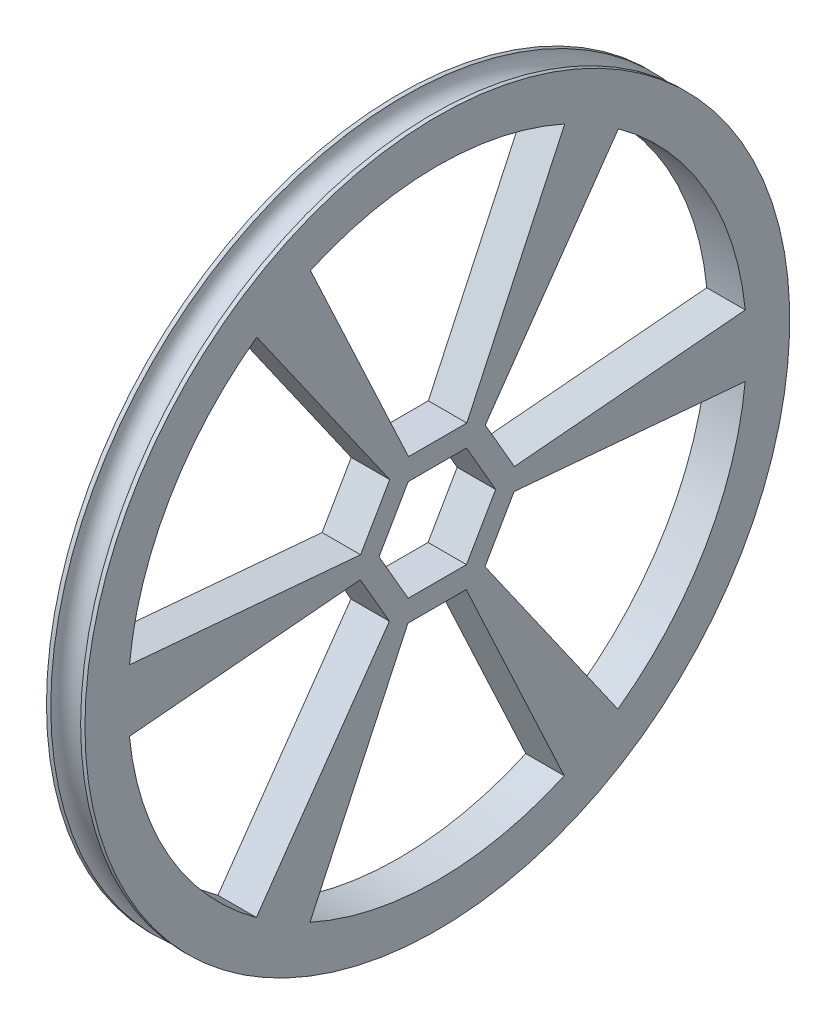
ISO-10303-21;
HEADER;
FILE_DESCRIPTION(('STEP AP214'),'2;1');
FILE_NAME('part.step','',(''),(''),'','','');
FILE_SCHEMA(('AUTOMOTIVE_DESIGN { 1 0 10303 214 1 1 1 1 }'));
ENDSEC;
DATA;
#1=APPLICATION_CONTEXT('core data for automotive mechanical design processes');
#2=APPLICATION_PROTOCOL_DEFINITION('international standard','automotive_design',2000,#1);
#3=PRODUCT_CONTEXT('',#1,'mechanical');
#4=PRODUCT('Part','Part','',(#3));
#5=PRODUCT_RELATED_PRODUCT_CATEGORY('part','',(#4));
#6=PRODUCT_DEFINITION_FORMATION('','',#4);
#7=PRODUCT_DEFINITION_CONTEXT('part definition',#1,'design');
#8=PRODUCT_DEFINITION('design','',#6,#7);
#9=PRODUCT_DEFINITION_SHAPE('','',#8);
#10=(LENGTH_UNIT() NAMED_UNIT(*) SI_UNIT(.MILLI.,.METRE.));
#11=(NAMED_UNIT(*) PLANE_ANGLE_UNIT() SI_UNIT($,.RADIAN.));
#12=(NAMED_UNIT(*) SI_UNIT($,.STERADIAN.) SOLID_ANGLE_UNIT());
#13=UNCERTAINTY_MEASURE_WITH_UNIT(LENGTH_MEASURE(1.E-05),#10,'distance_accuracy_value','');
#14=(GEOMETRIC_REPRESENTATION_CONTEXT(3) GLOBAL_UNCERTAINTY_ASSIGNED_CONTEXT((#13)) GLOBAL_UNIT_ASSIGNED_CONTEXT((#10,
#11,#12)) REPRESENTATION_CONTEXT('',''));
#15=CARTESIAN_POINT('',(0.,0.,0.));
#16=DIRECTION('',(0.,0.,1.));
#17=DIRECTION('',(1.,0.,0.));
#18=AXIS2_PLACEMENT_3D('',#15,#16,#17);
#19=CARTESIAN_POINT('',(4.0396,0.438161309822831,0.038334147405172));
#20=DIRECTION('',(0.,0.996194698091745,0.0871557427476677));
#21=DIRECTION('',(0.,-0.0871557427476677,0.996194698091745));
#22=AXIS2_PLACEMENT_3D('',#19,#20,#21);
#23=PLANE('',#22);
#24=DIRECTION('',(0.,0.0871557427476677,-0.996194698091745));
#25=VECTOR('',#24,1.);
#26=CARTESIAN_POINT('',(4.0386,0.438161309822831,0.038334147405172));
#27=LINE('',#26,#25);
#28=CARTESIAN_POINT('',(4.0386,1.23855993231517,-9.11026397073945));
#29=VERTEX_POINT('',#28);
#30=CARTESIAN_POINT('',(4.0386,3.62573925965265,-36.3958485382744));
#31=VERTEX_POINT('',#30);
#32=EDGE_CURVE('E42',#29,#31,#27,.T.);
#33=ORIENTED_EDGE('',*,*,#32,.T.);
#34=DIRECTION('',(-1.,0.,0.));
#35=VECTOR('',#34,1.);
#36=CARTESIAN_POINT('',(4.0396,3.62573925965265,-36.3958485382744));
#37=LINE('',#36,#35);
#38=CARTESIAN_POINT('',(-0.507999999999998,3.62573925965265,-36.3958485382744));
#39=VERTEX_POINT('',#38);
#40=EDGE_CURVE('E480',#31,#39,#37,.T.);
#41=ORIENTED_EDGE('',*,*,#40,.T.);
#42=DIRECTION('',(0.,0.0871557427476676,-0.996194698091745));
#43=VECTOR('',#42,1.);
#44=CARTESIAN_POINT('',(-0.507999999999998,0.438161309822831,0.038334147405172));
#45=LINE('',#44,#43);
#46=CARTESIAN_POINT('',(-0.507999999999998,1.23855993231517,-9.11026397073945));
#47=VERTEX_POINT('',#46);
#48=EDGE_CURVE('E11',#47,#39,#45,.T.);
#49=ORIENTED_EDGE('',*,*,#48,.F.);
#50=DIRECTION('',(-1.,0.,0.));
#51=VECTOR('',#50,1.);
#52=CARTESIAN_POINT('',(4.0396,1.23855993231518,-9.11026397073945));
#53=LINE('',#52,#51);
#54=EDGE_CURVE('E462',#29,#47,#53,.T.);
#55=ORIENTED_EDGE('',*,*,#54,.F.);
#56=EDGE_LOOP('',(#33,#41,#49,#55));
#57=FACE_BOUND('',#56,.T.);
#58=ADVANCED_FACE('F35',(#57),#23,.T.);
#59=CARTESIAN_POINT('',(4.0396,0.,0.));
#60=DIRECTION('',(-1.,0.,0.));
#61=DIRECTION('',(0.,0.866025403784433,0.50000000000001));
#62=AXIS2_PLACEMENT_3D('',#59,#60,#61);
#63=CYLINDRICAL_SURFACE('',#62,36.576);
#64=CARTESIAN_POINT('',(4.0386,0.,0.));
#65=DIRECTION('',(1.,0.,0.));
#66=DIRECTION('',(0.,-0.866025403784433,-0.50000000000001));
#67=AXIS2_PLACEMENT_3D('',#64,#65,#66);
#68=CIRCLE('',#67,36.576);
#69=CARTESIAN_POINT('',(4.0386,29.6680661941148,-21.3918120855065));
#70=VERTEX_POINT('',#69);
#71=EDGE_CURVE('E49',#31,#70,#68,.T.);
#72=ORIENTED_EDGE('',*,*,#71,.T.);
#73=DIRECTION('',(-1.,0.,0.));
#74=VECTOR('',#73,1.);
#75=CARTESIAN_POINT('',(4.0396,29.6680661941148,-21.3918120855065));
#76=LINE('',#75,#74);
#77=CARTESIAN_POINT('',(-0.507999999999998,29.6680661941148,-21.3918120855065));
#78=VERTEX_POINT('',#77);
#79=EDGE_CURVE('E474',#70,#78,#76,.T.);
#80=ORIENTED_EDGE('',*,*,#79,.T.);
#81=CARTESIAN_POINT('',(-0.507999999999998,0.,0.));
#82=DIRECTION('',(-1.,0.,0.));
#83=DIRECTION('',(0.,0.866025403784433,0.50000000000001));
#84=AXIS2_PLACEMENT_3D('',#81,#82,#83);
#85=CIRCLE('',#84,36.576);
#86=EDGE_CURVE('E56',#39,#78,#85,.F.);
#87=ORIENTED_EDGE('',*,*,#86,.F.);
#88=ORIENTED_EDGE('',*,*,#40,.F.);
#89=EDGE_LOOP('',(#72,#80,#87,#88));
#90=FACE_BOUND('',#89,.T.);
#91=ADVANCED_FACE('F491',(#90),#63,.F.);
#92=CARTESIAN_POINT('',(4.0396,-0.290369009890764,-0.414689922695186));
#93=DIRECTION('',(0.,0.573576436351037,0.819152044288998));
#94=DIRECTION('',(0.,-0.819152044288998,0.573576436351037));
#95=AXIS2_PLACEMENT_3D('',#92,#93,#94);
#96=PLANE('',#95);
#97=DIRECTION('',(-1.,0.,0.));
#98=VECTOR('',#97,1.);
#99=CARTESIAN_POINT('',(4.0396,7.2069837744007,-5.6643928588735));
#100=LINE('',#99,#98);
#101=CARTESIAN_POINT('',(4.0386,7.2069837744007,-5.6643928588735));
#102=VERTEX_POINT('',#101);
#103=CARTESIAN_POINT('',(-0.507999999999998,7.2069837744007,-5.6643928588735));
#104=VERTEX_POINT('',#103);
#105=EDGE_CURVE('E466',#102,#104,#100,.T.);
#106=ORIENTED_EDGE('',*,*,#105,.T.);
#107=DIRECTION('',(0.,0.819152044288998,-0.573576436351037));
#108=VECTOR('',#107,1.);
#109=CARTESIAN_POINT('',(-0.507999999999998,-0.290369009890764,-0.414689922695186));
#110=LINE('',#109,#108);
#111=EDGE_CURVE('E472',#104,#78,#110,.T.);
#112=ORIENTED_EDGE('',*,*,#111,.T.);
#113=ORIENTED_EDGE('',*,*,#79,.F.);
#114=DIRECTION('',(0.,0.819152044288998,-0.573576436351037));
#115=VECTOR('',#114,1.);
#116=CARTESIAN_POINT('',(4.0386,-0.290369009890764,-0.414689922695186));
#117=LINE('',#116,#115);
#118=EDGE_CURVE('E476',#102,#70,#117,.T.);
#119=ORIENTED_EDGE('',*,*,#118,.F.);
#120=EDGE_LOOP('',(#106,#112,#113,#119));
#121=FACE_BOUND('',#120,.T.);
#122=ADVANCED_FACE('F489',(#121),#96,.F.);
#123=CARTESIAN_POINT('',(4.0396,4.25450000000008,-7.36901016080174));
#124=DIRECTION('',(0.,-0.50000000000001,0.866025403784433));
#125=DIRECTION('',(0.,-0.866025403784433,-0.50000000000001));
#126=AXIS2_PLACEMENT_3D('',#123,#124,#125);
#127=PLANE('',#126);
#128=ORIENTED_EDGE('',*,*,#54,.T.);
#129=DIRECTION('',(0.,0.866025403784433,0.50000000000001));
#130=VECTOR('',#129,1.);
#131=CARTESIAN_POINT('',(-0.507999999999998,4.25450000000008,-7.36901016080174));
#132=LINE('',#131,#130);
#133=EDGE_CURVE('E464',#47,#104,#132,.T.);
#134=ORIENTED_EDGE('',*,*,#133,.T.);
#135=ORIENTED_EDGE('',*,*,#105,.F.);
#136=DIRECTION('',(0.,0.866025403784433,0.50000000000001));
#137=VECTOR('',#136,1.);
#138=CARTESIAN_POINT('',(4.0386,4.25450000000008,-7.36901016080174));
#139=LINE('',#138,#137);
#140=EDGE_CURVE('E469',#29,#102,#139,.T.);
#141=ORIENTED_EDGE('',*,*,#140,.F.);
#142=EDGE_LOOP('',(#128,#134,#135,#141));
#143=FACE_BOUND('',#142,.T.);
#144=ADVANCED_FACE('F496',(#143),#127,.F.);
#145=CARTESIAN_POINT('',(4.0396,0.252279000396711,-0.36029175155945));
#146=DIRECTION('',(0.,0.573576436351052,-0.819152044288988));
#147=DIRECTION('',(0.,0.819152044288988,0.573576436351052));
#148=AXIS2_PLACEMENT_3D('',#145,#146,#147);
#149=PLANE('',#148);
#150=DIRECTION('',(0.,-0.819152044288988,-0.573576436351052));
#151=VECTOR('',#150,1.);
#152=CARTESIAN_POINT('',(4.0386,0.252279000396711,-0.36029175155945));
#153=LINE('',#152,#151);
#154=CARTESIAN_POINT('',(4.0386,-7.27044006768488,-5.62775635086418));
#155=VERTEX_POINT('',#154);
#156=CARTESIAN_POINT('',(4.0386,-29.7068597966101,-21.3379065754949));
#157=VERTEX_POINT('',#156);
#158=EDGE_CURVE('E456',#155,#157,#153,.T.);
#159=ORIENTED_EDGE('',*,*,#158,.T.);
#160=DIRECTION('',(-1.,0.,0.));
#161=VECTOR('',#160,1.);
#162=CARTESIAN_POINT('',(4.0396,-29.7068597966101,-21.3379065754949));
#163=LINE('',#162,#161);
#164=CARTESIAN_POINT('',(-0.507999999999998,-29.7068597966101,-21.3379065754949));
#165=VERTEX_POINT('',#164);
#166=EDGE_CURVE('E453',#157,#165,#163,.T.);
#167=ORIENTED_EDGE('',*,*,#166,.T.);
#168=DIRECTION('',(0.,-0.819152044288988,-0.573576436351052));
#169=VECTOR('',#168,1.);
#170=CARTESIAN_POINT('',(-0.507999999999998,0.252279000396711,-0.36029175155945));
#171=LINE('',#170,#169);
#172=CARTESIAN_POINT('',(-0.507999999999998,-7.27044006768488,-5.62775635086418));
#173=VERTEX_POINT('',#172);
#174=EDGE_CURVE('E459',#173,#165,#171,.T.);
#175=ORIENTED_EDGE('',*,*,#174,.F.);
#176=DIRECTION('',(-1.,0.,0.));
#177=VECTOR('',#176,1.);
#178=CARTESIAN_POINT('',(4.0396,-7.27044006768488,-5.62775635086418));
#179=LINE('',#178,#177);
#180=EDGE_CURVE('E429',#155,#173,#179,.T.);
#181=ORIENTED_EDGE('',*,*,#180,.F.);
#182=EDGE_LOOP('',(#159,#167,#175,#181));
#183=FACE_BOUND('',#182,.T.);
#184=ADVANCED_FACE('F498',(#183),#149,.T.);
#185=CARTESIAN_POINT('',(4.0396,0.,0.));
#186=DIRECTION('',(-1.,0.,0.));
#187=DIRECTION('',(0.,0.866025403784443,-0.499999999999992));
#188=AXIS2_PLACEMENT_3D('',#185,#186,#187);
#189=CYLINDRICAL_SURFACE('',#188,36.576);
#190=CARTESIAN_POINT('',(4.0386,0.,0.));
#191=DIRECTION('',(1.,0.,0.));
#192=DIRECTION('',(0.,-0.866025403784443,0.499999999999992));
#193=AXIS2_PLACEMENT_3D('',#190,#191,#192);
#194=CIRCLE('',#193,36.576);
#195=CARTESIAN_POINT('',(4.0386,-3.6918196019743,-36.389205048015));
#196=VERTEX_POINT('',#195);
#197=EDGE_CURVE('E447',#157,#196,#194,.T.);
#198=ORIENTED_EDGE('',*,*,#197,.T.);
#199=DIRECTION('',(-1.,0.,0.));
#200=VECTOR('',#199,1.);
#201=CARTESIAN_POINT('',(4.0396,-3.6918196019743,-36.389205048015));
#202=LINE('',#201,#200);
#203=CARTESIAN_POINT('',(-0.507999999999998,-3.6918196019743,-36.389205048015));
#204=VERTEX_POINT('',#203);
#205=EDGE_CURVE('E441',#196,#204,#202,.T.);
#206=ORIENTED_EDGE('',*,*,#205,.T.);
#207=CARTESIAN_POINT('',(-0.507999999999998,0.,0.));
#208=DIRECTION('',(-1.,0.,0.));
#209=DIRECTION('',(0.,0.866025403784443,-0.499999999999992));
#210=AXIS2_PLACEMENT_3D('',#207,#208,#209);
#211=CIRCLE('',#210,36.576);
#212=EDGE_CURVE('E450',#165,#204,#211,.F.);
#213=ORIENTED_EDGE('',*,*,#212,.F.);
#214=ORIENTED_EDGE('',*,*,#166,.F.);
#215=EDGE_LOOP('',(#198,#206,#213,#214));
#216=FACE_BOUND('',#215,.T.);
#217=ADVANCED_FACE('F504',(#216),#189,.F.);
#218=CARTESIAN_POINT('',(4.0396,-0.504316512692818,0.0441219776895447));
#219=DIRECTION('',(0.,0.996194698091746,-0.0871557427476491));
#220=DIRECTION('',(0.,0.0871557427476491,0.996194698091746));
#221=AXIS2_PLACEMENT_3D('',#218,#219,#220);
#222=PLANE('',#221);
#223=DIRECTION('',(-1.,0.,0.));
#224=VECTOR('',#223,1.);
#225=CARTESIAN_POINT('',(4.0396,-1.30201622559928,-9.07362746273001));
#226=LINE('',#225,#224);
#227=CARTESIAN_POINT('',(4.0386,-1.30201622559928,-9.07362746273001));
#228=VERTEX_POINT('',#227);
#229=CARTESIAN_POINT('',(-0.507999999999998,-1.30201622559928,-9.07362746273001));
#230=VERTEX_POINT('',#229);
#231=EDGE_CURVE('E433',#228,#230,#226,.T.);
#232=ORIENTED_EDGE('',*,*,#231,.T.);
#233=DIRECTION('',(0.,-0.0871557427476492,-0.996194698091746));
#234=VECTOR('',#233,1.);
#235=CARTESIAN_POINT('',(-0.507999999999998,-0.504316512692818,0.0441219776895447));
#236=LINE('',#235,#234);
#237=EDGE_CURVE('E439',#230,#204,#236,.T.);
#238=ORIENTED_EDGE('',*,*,#237,.T.);
#239=ORIENTED_EDGE('',*,*,#205,.F.);
#240=DIRECTION('',(0.,-0.0871557427476491,-0.996194698091746));
#241=VECTOR('',#240,1.);
#242=CARTESIAN_POINT('',(4.0386,-0.504316512692818,0.0441219776895447));
#243=LINE('',#242,#241);
#244=EDGE_CURVE('E444',#228,#196,#243,.T.);
#245=ORIENTED_EDGE('',*,*,#244,.F.);
#246=EDGE_LOOP('',(#232,#238,#239,#245));
#247=FACE_BOUND('',#246,.T.);
#248=ADVANCED_FACE('F537',(#247),#222,.F.);
#249=CARTESIAN_POINT('',(4.0396,-4.25449999999994,-7.36901016080183));
#250=DIRECTION('',(0.,0.499999999999992,0.866025403784443));
#251=DIRECTION('',(0.,-0.866025403784443,0.499999999999992));
#252=AXIS2_PLACEMENT_3D('',#249,#250,#251);
#253=PLANE('',#252);
#254=ORIENTED_EDGE('',*,*,#180,.T.);
#255=DIRECTION('',(0.,0.866025403784443,-0.499999999999992));
#256=VECTOR('',#255,1.);
#257=CARTESIAN_POINT('',(-0.507999999999998,-4.25449999999994,-7.36901016080183));
#258=LINE('',#257,#256);
#259=EDGE_CURVE('E431',#173,#230,#258,.T.);
#260=ORIENTED_EDGE('',*,*,#259,.T.);
#261=ORIENTED_EDGE('',*,*,#231,.F.);
#262=DIRECTION('',(0.,0.866025403784443,-0.499999999999992));
#263=VECTOR('',#262,1.);
#264=CARTESIAN_POINT('',(4.0386,-4.25449999999994,-7.36901016080183));
#265=LINE('',#264,#263);
#266=EDGE_CURVE('E436',#155,#228,#265,.T.);
#267=ORIENTED_EDGE('',*,*,#266,.F.);
#268=EDGE_LOOP('',(#254,#260,#261,#267));
#269=FACE_BOUND('',#268,.T.);
#270=ADVANCED_FACE('F547',(#269),#253,.F.);
#271=CARTESIAN_POINT('',(4.0396,-0.185882309426124,-0.398625898964619));
#272=DIRECTION('',(0.,-0.422618261740701,-0.906307787036649));
#273=DIRECTION('',(0.,0.906307787036649,-0.422618261740701));
#274=AXIS2_PLACEMENT_3D('',#271,#272,#273);
#275=PLANE('',#274);
#276=DIRECTION('',(0.,-0.906307787036649,0.422618261740701));
#277=VECTOR('',#276,1.);
#278=CARTESIAN_POINT('',(4.0386,-0.185882309426124,-0.398625898964619));
#279=LINE('',#278,#277);
#280=CARTESIAN_POINT('',(4.0386,-8.509,3.48250761987535));
#281=VERTEX_POINT('',#280);
#282=CARTESIAN_POINT('',(4.0386,-33.3325990562625,15.0579419627798));
#283=VERTEX_POINT('',#282);
#284=EDGE_CURVE('E423',#281,#283,#279,.T.);
#285=ORIENTED_EDGE('',*,*,#284,.T.);
#286=DIRECTION('',(-1.,0.,0.));
#287=VECTOR('',#286,1.);
#288=CARTESIAN_POINT('',(4.0396,-33.3325990562625,15.0579419627798));
#289=LINE('',#288,#287);
#290=CARTESIAN_POINT('',(-0.507999999999998,-33.3325990562625,15.0579419627798));
#291=VERTEX_POINT('',#290);
#292=EDGE_CURVE('E420',#283,#291,#289,.T.);
#293=ORIENTED_EDGE('',*,*,#292,.T.);
#294=DIRECTION('',(0.,-0.906307787036649,0.422618261740701));
#295=VECTOR('',#294,1.);
#296=CARTESIAN_POINT('',(-0.507999999999998,-0.185882309426124,-0.398625898964619));
#297=LINE('',#296,#295);
#298=CARTESIAN_POINT('',(-0.507999999999998,-8.509,3.48250761987535));
#299=VERTEX_POINT('',#298);
#300=EDGE_CURVE('E426',#299,#291,#297,.T.);
#301=ORIENTED_EDGE('',*,*,#300,.F.);
#302=DIRECTION('',(-1.,0.,0.));
#303=VECTOR('',#302,1.);
#304=CARTESIAN_POINT('',(4.0396,-8.509,3.48250761987535));
#305=LINE('',#304,#303);
#306=EDGE_CURVE('E396',#281,#299,#305,.T.);
#307=ORIENTED_EDGE('',*,*,#306,.F.);
#308=EDGE_LOOP('',(#285,#293,#301,#307));
#309=FACE_BOUND('',#308,.T.);
#310=ADVANCED_FACE('F557',(#309),#275,.T.);
#311=CARTESIAN_POINT('',(4.0396,0.,0.));
#312=DIRECTION('',(-1.,0.,0.));
#313=DIRECTION('',(0.,0.,-1.));
#314=AXIS2_PLACEMENT_3D('',#311,#312,#313);
#315=CYLINDRICAL_SURFACE('',#314,36.576);
#316=CARTESIAN_POINT('',(4.0386,0.,0.));
#317=DIRECTION('',(1.,0.,0.));
#318=DIRECTION('',(0.,0.,1.));
#319=AXIS2_PLACEMENT_3D('',#316,#317,#318);
#320=CIRCLE('',#319,36.576);
#321=CARTESIAN_POINT('',(4.0386,-33.3598857960892,-14.9973929625081));
#322=VERTEX_POINT('',#321);
#323=EDGE_CURVE('E414',#283,#322,#320,.T.);
#324=ORIENTED_EDGE('',*,*,#323,.T.);
#325=DIRECTION('',(-1.,0.,0.));
#326=VECTOR('',#325,1.);
#327=CARTESIAN_POINT('',(4.0396,-33.3598857960892,-14.9973929625081));
#328=LINE('',#327,#326);
#329=CARTESIAN_POINT('',(-0.507999999999998,-33.3598857960892,-14.9973929625081));
#330=VERTEX_POINT('',#329);
#331=EDGE_CURVE('E408',#322,#330,#328,.T.);
#332=ORIENTED_EDGE('',*,*,#331,.T.);
#333=CARTESIAN_POINT('',(-0.507999999999998,0.,0.));
#334=DIRECTION('',(-1.,0.,0.));
#335=DIRECTION('',(0.,0.,-1.));
#336=AXIS2_PLACEMENT_3D('',#333,#334,#335);
#337=CIRCLE('',#336,36.576);
#338=EDGE_CURVE('E417',#291,#330,#337,.F.);
#339=ORIENTED_EDGE('',*,*,#338,.F.);
#340=ORIENTED_EDGE('',*,*,#292,.F.);
#341=EDGE_LOOP('',(#324,#332,#339,#340));
#342=FACE_BOUND('',#341,.T.);
#343=ADVANCED_FACE('F567',(#342),#315,.F.);
#344=CARTESIAN_POINT('',(4.0396,-0.213947502802049,0.458811900384732));
#345=DIRECTION('',(0.,0.422618261740699,-0.90630778703665));
#346=DIRECTION('',(0.,0.90630778703665,0.422618261740699));
#347=AXIS2_PLACEMENT_3D('',#344,#345,#346);
#348=PLANE('',#347);
#349=DIRECTION('',(-1.,0.,0.));
#350=VECTOR('',#349,1.);
#351=CARTESIAN_POINT('',(4.0396,-8.509,-3.40923460385642));
#352=LINE('',#351,#350);
#353=CARTESIAN_POINT('',(4.0386,-8.509,-3.40923460385642));
#354=VERTEX_POINT('',#353);
#355=CARTESIAN_POINT('',(-0.507999999999998,-8.509,-3.40923460385642));
#356=VERTEX_POINT('',#355);
#357=EDGE_CURVE('E400',#354,#356,#352,.T.);
#358=ORIENTED_EDGE('',*,*,#357,.T.);
#359=DIRECTION('',(0.,-0.90630778703665,-0.422618261740699));
#360=VECTOR('',#359,1.);
#361=CARTESIAN_POINT('',(-0.507999999999998,-0.213947502802049,0.458811900384732));
#362=LINE('',#361,#360);
#363=EDGE_CURVE('E406',#356,#330,#362,.T.);
#364=ORIENTED_EDGE('',*,*,#363,.T.);
#365=ORIENTED_EDGE('',*,*,#331,.F.);
#366=DIRECTION('',(0.,-0.90630778703665,-0.422618261740699));
#367=VECTOR('',#366,1.);
#368=CARTESIAN_POINT('',(4.0386,-0.213947502802049,0.458811900384732));
#369=LINE('',#368,#367);
#370=EDGE_CURVE('E411',#354,#322,#369,.T.);
#371=ORIENTED_EDGE('',*,*,#370,.F.);
#372=EDGE_LOOP('',(#358,#364,#365,#371));
#373=FACE_BOUND('',#372,.T.);
#374=ADVANCED_FACE('F577',(#373),#348,.F.);
#375=CARTESIAN_POINT('',(4.0396,-8.509,0.));
#376=DIRECTION('',(0.,1.,0.));
#377=DIRECTION('',(0.,0.,1.));
#378=AXIS2_PLACEMENT_3D('',#375,#376,#377);
#379=PLANE('',#378);
#380=ORIENTED_EDGE('',*,*,#306,.T.);
#381=DIRECTION('',(0.,0.,-1.));
#382=VECTOR('',#381,1.);
#383=CARTESIAN_POINT('',(-0.507999999999998,-8.509,0.));
#384=LINE('',#383,#382);
#385=EDGE_CURVE('E398',#299,#356,#384,.T.);
#386=ORIENTED_EDGE('',*,*,#385,.T.);
#387=ORIENTED_EDGE('',*,*,#357,.F.);
#388=DIRECTION('',(0.,0.,-1.));
#389=VECTOR('',#388,1.);
#390=CARTESIAN_POINT('',(4.0386,-8.509,0.));
#391=LINE('',#390,#389);
#392=EDGE_CURVE('E403',#281,#354,#391,.T.);
#393=ORIENTED_EDGE('',*,*,#392,.F.);
#394=EDGE_LOOP('',(#380,#386,#387,#393));
#395=FACE_BOUND('',#394,.T.);
#396=ADVANCED_FACE('F587',(#395),#379,.F.);
#397=CARTESIAN_POINT('',(4.0396,-0.438161309822831,-0.0383341474051689));
#398=DIRECTION('',(0.,-0.996194698091746,-0.0871557427476607));
#399=DIRECTION('',(0.,0.0871557427476607,-0.996194698091746));
#400=AXIS2_PLACEMENT_3D('',#397,#398,#399);
#401=PLANE('',#400);
#402=DIRECTION('',(0.,-0.0871557427476607,0.996194698091746));
#403=VECTOR('',#402,1.);
#404=CARTESIAN_POINT('',(4.0386,-0.438161309822831,-0.0383341474051689));
#405=LINE('',#404,#403);
#406=CARTESIAN_POINT('',(4.0386,-1.23855993231511,9.11026397073946));
#407=VERTEX_POINT('',#406);
#408=CARTESIAN_POINT('',(4.0386,-3.62573925965239,36.3958485382745));
#409=VERTEX_POINT('',#408);
#410=EDGE_CURVE('E390',#407,#409,#405,.T.);
#411=ORIENTED_EDGE('',*,*,#410,.T.);
#412=DIRECTION('',(-1.,0.,0.));
#413=VECTOR('',#412,1.);
#414=CARTESIAN_POINT('',(4.0396,-3.62573925965239,36.3958485382745));
#415=LINE('',#414,#413);
#416=CARTESIAN_POINT('',(-0.507999999999998,-3.62573925965239,36.3958485382745));
#417=VERTEX_POINT('',#416);
#418=EDGE_CURVE('E387',#409,#417,#415,.T.);
#419=ORIENTED_EDGE('',*,*,#418,.T.);
#420=DIRECTION('',(0.,-0.0871557427476607,0.996194698091746));
#421=VECTOR('',#420,1.);
#422=CARTESIAN_POINT('',(-0.507999999999998,-0.438161309822831,-0.0383341474051689));
#423=LINE('',#422,#421);
#424=CARTESIAN_POINT('',(-0.507999999999998,-1.23855993231511,9.11026397073946));
#425=VERTEX_POINT('',#424);
#426=EDGE_CURVE('E393',#425,#417,#423,.T.);
#427=ORIENTED_EDGE('',*,*,#426,.F.);
#428=DIRECTION('',(-1.,0.,0.));
#429=VECTOR('',#428,1.);
#430=CARTESIAN_POINT('',(4.0396,-1.23855993231511,9.11026397073946));
#431=LINE('',#430,#429);
#432=EDGE_CURVE('E363',#407,#425,#431,.T.);
#433=ORIENTED_EDGE('',*,*,#432,.F.);
#434=EDGE_LOOP('',(#411,#419,#427,#433));
#435=FACE_BOUND('',#434,.T.);
#436=ADVANCED_FACE('F597',(#435),#401,.T.);
#437=CARTESIAN_POINT('',(4.0396,0.,0.));
#438=DIRECTION('',(-1.,0.,0.));
#439=DIRECTION('',(0.,-0.866025403784436,-0.500000000000004));
#440=AXIS2_PLACEMENT_3D('',#437,#438,#439);
#441=CYLINDRICAL_SURFACE('',#440,36.576);
#442=CARTESIAN_POINT('',(4.0386,0.,0.));
#443=DIRECTION('',(1.,0.,0.));
#444=DIRECTION('',(0.,0.866025403784436,0.500000000000004));
#445=AXIS2_PLACEMENT_3D('',#442,#443,#444);
#446=CIRCLE('',#445,36.576);
#447=CARTESIAN_POINT('',(4.0386,-29.6680661941146,21.3918120855067));
#448=VERTEX_POINT('',#447);
#449=EDGE_CURVE('E381',#409,#448,#446,.T.);
#450=ORIENTED_EDGE('',*,*,#449,.T.);
#451=DIRECTION('',(-1.,0.,0.));
#452=VECTOR('',#451,1.);
#453=CARTESIAN_POINT('',(4.0396,-29.6680661941146,21.3918120855067));
#454=LINE('',#453,#452);
#455=CARTESIAN_POINT('',(-0.507999999999998,-29.6680661941146,21.3918120855067));
#456=VERTEX_POINT('',#455);
#457=EDGE_CURVE('E375',#448,#456,#454,.T.);
#458=ORIENTED_EDGE('',*,*,#457,.T.);
#459=CARTESIAN_POINT('',(-0.507999999999998,0.,0.));
#460=DIRECTION('',(-1.,0.,0.));
#461=DIRECTION('',(0.,-0.866025403784436,-0.500000000000004));
#462=AXIS2_PLACEMENT_3D('',#459,#460,#461);
#463=CIRCLE('',#462,36.576);
#464=EDGE_CURVE('E384',#417,#456,#463,.F.);
#465=ORIENTED_EDGE('',*,*,#464,.F.);
#466=ORIENTED_EDGE('',*,*,#418,.F.);
#467=EDGE_LOOP('',(#450,#458,#465,#466));
#468=FACE_BOUND('',#467,.T.);
#469=ADVANCED_FACE('F607',(#468),#441,.F.);
#470=CARTESIAN_POINT('',(4.0396,0.290369009890767,0.414689922695184));
#471=DIRECTION('',(0.,-0.573576436351042,-0.819152044288995));
#472=DIRECTION('',(0.,0.819152044288995,-0.573576436351042));
#473=AXIS2_PLACEMENT_3D('',#470,#471,#472);
#474=PLANE('',#473);
#475=DIRECTION('',(-1.,0.,0.));
#476=VECTOR('',#475,1.);
#477=CARTESIAN_POINT('',(4.0396,-7.20698377440066,5.66439285887355));
#478=LINE('',#477,#476);
#479=CARTESIAN_POINT('',(4.0386,-7.20698377440066,5.66439285887355));
#480=VERTEX_POINT('',#479);
#481=CARTESIAN_POINT('',(-0.507999999999998,-7.20698377440066,5.66439285887355));
#482=VERTEX_POINT('',#481);
#483=EDGE_CURVE('E367',#480,#482,#478,.T.);
#484=ORIENTED_EDGE('',*,*,#483,.T.);
#485=DIRECTION('',(0.,-0.819152044288994,0.573576436351042));
#486=VECTOR('',#485,1.);
#487=CARTESIAN_POINT('',(-0.507999999999998,0.290369009890767,0.414689922695184));
#488=LINE('',#487,#486);
#489=EDGE_CURVE('E373',#482,#456,#488,.T.);
#490=ORIENTED_EDGE('',*,*,#489,.T.);
#491=ORIENTED_EDGE('',*,*,#457,.F.);
#492=DIRECTION('',(0.,-0.819152044288995,0.573576436351042));
#493=VECTOR('',#492,1.);
#494=CARTESIAN_POINT('',(4.0386,0.290369009890767,0.414689922695184));
#495=LINE('',#494,#493);
#496=EDGE_CURVE('E378',#480,#448,#495,.T.);
#497=ORIENTED_EDGE('',*,*,#496,.F.);
#498=EDGE_LOOP('',(#484,#490,#491,#497));
#499=FACE_BOUND('',#498,.T.);
#500=ADVANCED_FACE('F617',(#499),#474,.F.);
#501=CARTESIAN_POINT('',(4.0396,-4.25450000000003,7.36901016080177));
#502=DIRECTION('',(0.,0.500000000000004,-0.866025403784437));
#503=DIRECTION('',(0.,0.866025403784437,0.500000000000004));
#504=AXIS2_PLACEMENT_3D('',#501,#502,#503);
#505=PLANE('',#504);
#506=ORIENTED_EDGE('',*,*,#432,.T.);
#507=DIRECTION('',(0.,-0.866025403784437,-0.500000000000004));
#508=VECTOR('',#507,1.);
#509=CARTESIAN_POINT('',(-0.507999999999998,-4.25450000000003,7.36901016080177));
#510=LINE('',#509,#508);
#511=EDGE_CURVE('E365',#425,#482,#510,.T.);
#512=ORIENTED_EDGE('',*,*,#511,.T.);
#513=ORIENTED_EDGE('',*,*,#483,.F.);
#514=DIRECTION('',(0.,-0.866025403784437,-0.500000000000004));
#515=VECTOR('',#514,1.);
#516=CARTESIAN_POINT('',(4.0386,-4.25450000000003,7.36901016080177));
#517=LINE('',#516,#515);
#518=EDGE_CURVE('E370',#407,#480,#517,.T.);
#519=ORIENTED_EDGE('',*,*,#518,.F.);
#520=EDGE_LOOP('',(#506,#512,#513,#519));
#521=FACE_BOUND('',#520,.T.);
#522=ADVANCED_FACE('F627',(#521),#505,.F.);
#523=CARTESIAN_POINT('',(4.0396,-0.252279000396708,0.360291751559452));
#524=DIRECTION('',(0.,-0.573576436351046,0.819152044288992));
#525=DIRECTION('',(0.,-0.819152044288992,-0.573576436351046));
#526=AXIS2_PLACEMENT_3D('',#523,#524,#525);
#527=PLANE('',#526);
#528=DIRECTION('',(0.,0.819152044288992,0.573576436351046));
#529=VECTOR('',#528,1.);
#530=CARTESIAN_POINT('',(4.0386,-0.252279000396708,0.360291751559452));
#531=LINE('',#530,#529);
#532=CARTESIAN_POINT('',(4.0386,7.27044006768492,5.62775635086413));
#533=VERTEX_POINT('',#532);
#534=CARTESIAN_POINT('',(4.0386,29.7068597966103,21.3379065754947));
#535=VERTEX_POINT('',#534);
#536=EDGE_CURVE('E357',#533,#535,#531,.T.);
#537=ORIENTED_EDGE('',*,*,#536,.T.);
#538=DIRECTION('',(-1.,0.,0.));
#539=VECTOR('',#538,1.);
#540=CARTESIAN_POINT('',(4.0396,29.7068597966103,21.3379065754947));
#541=LINE('',#540,#539);
#542=CARTESIAN_POINT('',(-0.507999999999998,29.7068597966103,21.3379065754947));
#543=VERTEX_POINT('',#542);
#544=EDGE_CURVE('E354',#535,#543,#541,.T.);
#545=ORIENTED_EDGE('',*,*,#544,.T.);
#546=DIRECTION('',(0.,0.819152044288992,0.573576436351046));
#547=VECTOR('',#546,1.);
#548=CARTESIAN_POINT('',(-0.507999999999998,-0.252279000396708,0.360291751559452));
#549=LINE('',#548,#547);
#550=CARTESIAN_POINT('',(-0.507999999999998,7.27044006768492,5.62775635086413));
#551=VERTEX_POINT('',#550);
#552=EDGE_CURVE('E360',#551,#543,#549,.T.);
#553=ORIENTED_EDGE('',*,*,#552,.F.);
#554=DIRECTION('',(-1.,0.,0.));
#555=VECTOR('',#554,1.);
#556=CARTESIAN_POINT('',(4.0396,7.27044006768492,5.62775635086413));
#557=LINE('',#556,#555);
#558=EDGE_CURVE('E330',#533,#551,#557,.T.);
#559=ORIENTED_EDGE('',*,*,#558,.F.);
#560=EDGE_LOOP('',(#537,#545,#553,#559));
#561=FACE_BOUND('',#560,.T.);
#562=ADVANCED_FACE('F637',(#561),#527,.T.);
#563=CARTESIAN_POINT('',(4.0396,0.,0.));
#564=DIRECTION('',(-1.,0.,0.));
#565=DIRECTION('',(0.,-0.86602540378444,0.499999999999998));
#566=AXIS2_PLACEMENT_3D('',#563,#564,#565);
#567=CYLINDRICAL_SURFACE('',#566,36.576);
#568=CARTESIAN_POINT('',(4.0386,0.,0.));
#569=DIRECTION('',(1.,0.,0.));
#570=DIRECTION('',(0.,0.86602540378444,-0.499999999999998));
#571=AXIS2_PLACEMENT_3D('',#568,#569,#570);
#572=CIRCLE('',#571,36.576);
#573=CARTESIAN_POINT('',(4.0386,3.69181960197455,36.3892050480149));
#574=VERTEX_POINT('',#573);
#575=EDGE_CURVE('E348',#535,#574,#572,.T.);
#576=ORIENTED_EDGE('',*,*,#575,.T.);
#577=DIRECTION('',(-1.,0.,0.));
#578=VECTOR('',#577,1.);
#579=CARTESIAN_POINT('',(4.0396,3.69181960197456,36.3892050480149));
#580=LINE('',#579,#578);
#581=CARTESIAN_POINT('',(-0.507999999999998,3.69181960197456,36.3892050480149));
#582=VERTEX_POINT('',#581);
#583=EDGE_CURVE('E342',#574,#582,#580,.T.);
#584=ORIENTED_EDGE('',*,*,#583,.T.);
#585=CARTESIAN_POINT('',(-0.507999999999998,0.,0.));
#586=DIRECTION('',(-1.,0.,0.));
#587=DIRECTION('',(0.,-0.86602540378444,0.499999999999998));
#588=AXIS2_PLACEMENT_3D('',#585,#586,#587);
#589=CIRCLE('',#588,36.576);
#590=EDGE_CURVE('E351',#543,#582,#589,.F.);
#591=ORIENTED_EDGE('',*,*,#590,.F.);
#592=ORIENTED_EDGE('',*,*,#544,.F.);
#593=EDGE_LOOP('',(#576,#584,#591,#592));
#594=FACE_BOUND('',#593,.T.);
#595=ADVANCED_FACE('F647',(#594),#567,.F.);
#596=CARTESIAN_POINT('',(4.0396,0.504316512692818,-0.0441219776895482));
#597=DIRECTION('',(0.,-0.996194698091746,0.087155742747656));
#598=DIRECTION('',(0.,-0.087155742747656,-0.996194698091746));
#599=AXIS2_PLACEMENT_3D('',#596,#597,#598);
#600=PLANE('',#599);
#601=DIRECTION('',(-1.,0.,0.));
#602=VECTOR('',#601,1.);
#603=CARTESIAN_POINT('',(4.0396,1.30201622559935,9.07362746273));
#604=LINE('',#603,#602);
#605=CARTESIAN_POINT('',(4.0386,1.30201622559935,9.07362746273));
#606=VERTEX_POINT('',#605);
#607=CARTESIAN_POINT('',(-0.507999999999998,1.30201622559935,9.07362746273));
#608=VERTEX_POINT('',#607);
#609=EDGE_CURVE('E334',#606,#608,#604,.T.);
#610=ORIENTED_EDGE('',*,*,#609,.T.);
#611=DIRECTION('',(0.,0.0871557427476561,0.996194698091746));
#612=VECTOR('',#611,1.);
#613=CARTESIAN_POINT('',(-0.507999999999998,0.504316512692818,-0.0441219776895482));
#614=LINE('',#613,#612);
#615=EDGE_CURVE('E340',#608,#582,#614,.T.);
#616=ORIENTED_EDGE('',*,*,#615,.T.);
#617=ORIENTED_EDGE('',*,*,#583,.F.);
#618=DIRECTION('',(0.,0.087155742747656,0.996194698091746));
#619=VECTOR('',#618,1.);
#620=CARTESIAN_POINT('',(4.0386,0.504316512692818,-0.0441219776895482));
#621=LINE('',#620,#619);
#622=EDGE_CURVE('E345',#606,#574,#621,.T.);
#623=ORIENTED_EDGE('',*,*,#622,.F.);
#624=EDGE_LOOP('',(#610,#616,#617,#623));
#625=FACE_BOUND('',#624,.T.);
#626=ADVANCED_FACE('F657',(#625),#600,.F.);
#627=CARTESIAN_POINT('',(4.0396,4.25449999999999,7.3690101608018));
#628=DIRECTION('',(0.,-0.499999999999998,-0.86602540378444));
#629=DIRECTION('',(0.,0.86602540378444,-0.499999999999998));
#630=AXIS2_PLACEMENT_3D('',#627,#628,#629);
#631=PLANE('',#630);
#632=ORIENTED_EDGE('',*,*,#558,.T.);
#633=DIRECTION('',(0.,-0.86602540378444,0.499999999999998));
#634=VECTOR('',#633,1.);
#635=CARTESIAN_POINT('',(-0.507999999999998,4.25449999999999,7.3690101608018));
#636=LINE('',#635,#634);
#637=EDGE_CURVE('E332',#551,#608,#636,.T.);
#638=ORIENTED_EDGE('',*,*,#637,.T.);
#639=ORIENTED_EDGE('',*,*,#609,.F.);
#640=DIRECTION('',(0.,-0.86602540378444,0.499999999999998));
#641=VECTOR('',#640,1.);
#642=CARTESIAN_POINT('',(4.0386,4.25449999999999,7.3690101608018));
#643=LINE('',#642,#641);
#644=EDGE_CURVE('E337',#533,#606,#643,.T.);
#645=ORIENTED_EDGE('',*,*,#644,.F.);
#646=EDGE_LOOP('',(#632,#638,#639,#645));
#647=FACE_BOUND('',#646,.T.);
#648=ADVANCED_FACE('F667',(#647),#631,.F.);
#649=CARTESIAN_POINT('',(-0.507999999999998,0.,0.));
#650=DIRECTION('',(1.,0.,0.));
#651=DIRECTION('',(0.,0.,-1.));
#652=AXIS2_PLACEMENT_3D('',#649,#650,#651);
#653=PLANE('',#652);
#654=ORIENTED_EDGE('',*,*,#48,.T.);
#655=ORIENTED_EDGE('',*,*,#86,.T.);
#656=ORIENTED_EDGE('',*,*,#111,.F.);
#657=ORIENTED_EDGE('',*,*,#133,.F.);
#658=EDGE_LOOP('',(#654,#655,#656,#657));
#659=FACE_BOUND('',#658,.T.);
#660=ORIENTED_EDGE('',*,*,#174,.T.);
#661=ORIENTED_EDGE('',*,*,#212,.T.);
#662=ORIENTED_EDGE('',*,*,#237,.F.);
#663=ORIENTED_EDGE('',*,*,#259,.F.);
#664=EDGE_LOOP('',(#660,#661,#662,#663));
#665=FACE_BOUND('',#664,.T.);
#666=ORIENTED_EDGE('',*,*,#300,.T.);
#667=ORIENTED_EDGE('',*,*,#338,.T.);
#668=ORIENTED_EDGE('',*,*,#363,.F.);
#669=ORIENTED_EDGE('',*,*,#385,.F.);
#670=EDGE_LOOP('',(#666,#667,#668,#669));
#671=FACE_BOUND('',#670,.T.);
#672=ORIENTED_EDGE('',*,*,#426,.T.);
#673=ORIENTED_EDGE('',*,*,#464,.T.);
#674=ORIENTED_EDGE('',*,*,#489,.F.);
#675=ORIENTED_EDGE('',*,*,#511,.F.);
#676=EDGE_LOOP('',(#672,#673,#674,#675));
#677=FACE_BOUND('',#676,.T.);
#678=ORIENTED_EDGE('',*,*,#552,.T.);
#679=ORIENTED_EDGE('',*,*,#590,.T.);
#680=ORIENTED_EDGE('',*,*,#615,.F.);
#681=ORIENTED_EDGE('',*,*,#637,.F.);
#682=EDGE_LOOP('',(#678,#679,#680,#681));
#683=FACE_BOUND('',#682,.T.);
#684=DIRECTION('',(0.,0.906307787036649,-0.422618261740701));
#685=VECTOR('',#684,1.);
#686=CARTESIAN_POINT('',(-0.507999999999998,0.185882309426124,0.398625898964619));
#687=LINE('',#686,#685);
#688=CARTESIAN_POINT('',(-0.507999999999998,8.509,-3.48250761987535));
#689=VERTEX_POINT('',#688);
#690=CARTESIAN_POINT('',(-0.507999999999998,33.3325990562625,-15.0579419627798));
#691=VERTEX_POINT('',#690);
#692=EDGE_CURVE('E294',#689,#691,#687,.T.);
#693=ORIENTED_EDGE('',*,*,#692,.T.);
#694=CARTESIAN_POINT('',(-0.507999999999998,0.,0.));
#695=DIRECTION('',(-1.,0.,0.));
#696=DIRECTION('',(0.,0.,1.));
#697=AXIS2_PLACEMENT_3D('',#694,#695,#696);
#698=CIRCLE('',#697,36.576);
#699=CARTESIAN_POINT('',(-0.507999999999998,33.3598857960892,14.9973929625081));
#700=VERTEX_POINT('',#699);
#701=EDGE_CURVE('E303',#691,#700,#698,.F.);
#702=ORIENTED_EDGE('',*,*,#701,.T.);
#703=DIRECTION('',(0.,0.90630778703665,0.422618261740699));
#704=VECTOR('',#703,1.);
#705=CARTESIAN_POINT('',(-0.507999999999998,0.213947502802049,-0.458811900384732));
#706=LINE('',#705,#704);
#707=CARTESIAN_POINT('',(-0.507999999999998,8.509,3.40923460385642));
#708=VERTEX_POINT('',#707);
#709=EDGE_CURVE('E300',#708,#700,#706,.T.);
#710=ORIENTED_EDGE('',*,*,#709,.F.);
#711=DIRECTION('',(0.,0.,1.));
#712=VECTOR('',#711,1.);
#713=CARTESIAN_POINT('',(-0.507999999999998,8.509,0.));
#714=LINE('',#713,#712);
#715=EDGE_CURVE('E297',#689,#708,#714,.T.);
#716=ORIENTED_EDGE('',*,*,#715,.F.);
#717=EDGE_LOOP('',(#693,#702,#710,#716));
#718=FACE_BOUND('',#717,.T.);
#719=CARTESIAN_POINT('',(-0.508,0.,0.));
#720=DIRECTION('',(-1.,0.,0.));
#721=DIRECTION('',(0.,0.,1.));
#722=AXIS2_PLACEMENT_3D('',#719,#720,#721);
#723=CIRCLE('',#722,41.656);
#724=CARTESIAN_POINT('',(-0.508,0.,41.656));
#725=VERTEX_POINT('',#724);
#726=EDGE_CURVE('E327',#725,#725,#723,.T.);
#727=ORIENTED_EDGE('',*,*,#726,.T.);
#728=EDGE_LOOP('',(#727));
#729=FACE_BOUND('',#728,.T.);
#730=DIRECTION('',(0.,0.866025403784439,0.5));
#731=VECTOR('',#730,1.);
#732=CARTESIAN_POINT('',(-0.507999999999998,2.9845,-5.16930563518932));
#733=LINE('',#732,#731);
#734=CARTESIAN_POINT('',(-0.507999999999998,0.,-6.89240751358575));
#735=VERTEX_POINT('',#734);
#736=CARTESIAN_POINT('',(-0.507999999999998,5.969,-3.44620375679288));
#737=VERTEX_POINT('',#736);
#738=EDGE_CURVE('E241',#735,#737,#733,.T.);
#739=ORIENTED_EDGE('',*,*,#738,.T.);
#740=DIRECTION('',(0.,0.,1.));
#741=VECTOR('',#740,1.);
#742=CARTESIAN_POINT('',(-0.507999999999998,5.969,0.));
#743=LINE('',#742,#741);
#744=CARTESIAN_POINT('',(-0.507999999999998,5.969,3.44620375679288));
#745=VERTEX_POINT('',#744);
#746=EDGE_CURVE('E246',#737,#745,#743,.T.);
#747=ORIENTED_EDGE('',*,*,#746,.T.);
#748=DIRECTION('',(0.,-0.866025403784439,0.5));
#749=VECTOR('',#748,1.);
#750=CARTESIAN_POINT('',(-0.507999999999998,2.9845,5.16930563518931));
#751=LINE('',#750,#749);
#752=CARTESIAN_POINT('',(-0.507999999999998,0.,6.89240751358575));
#753=VERTEX_POINT('',#752);
#754=EDGE_CURVE('E275',#745,#753,#751,.T.);
#755=ORIENTED_EDGE('',*,*,#754,.T.);
#756=DIRECTION('',(0.,-0.866025403784439,-0.5));
#757=VECTOR('',#756,1.);
#758=CARTESIAN_POINT('',(-0.507999999999998,-2.9845,5.16930563518931));
#759=LINE('',#758,#757);
#760=CARTESIAN_POINT('',(-0.507999999999998,-5.969,3.44620375679287));
#761=VERTEX_POINT('',#760);
#762=EDGE_CURVE('E272',#753,#761,#759,.T.);
#763=ORIENTED_EDGE('',*,*,#762,.T.);
#764=DIRECTION('',(0.,0.,-1.));
#765=VECTOR('',#764,1.);
#766=CARTESIAN_POINT('',(-0.507999999999998,-5.969,0.));
#767=LINE('',#766,#765);
#768=CARTESIAN_POINT('',(-0.507999999999998,-5.969,-3.44620375679288));
#769=VERTEX_POINT('',#768);
#770=EDGE_CURVE('E269',#761,#769,#767,.T.);
#771=ORIENTED_EDGE('',*,*,#770,.T.);
#772=DIRECTION('',(0.,0.866025403784439,-0.5));
#773=VECTOR('',#772,1.);
#774=CARTESIAN_POINT('',(-0.507999999999998,-2.9845,-5.16930563518931));
#775=LINE('',#774,#773);
#776=EDGE_CURVE('E262',#769,#735,#775,.T.);
#777=ORIENTED_EDGE('',*,*,#776,.T.);
#778=EDGE_LOOP('',(#739,#747,#755,#763,#771,#777));
#779=FACE_BOUND('',#778,.T.);
#780=ADVANCED_FACE('F493',(#659,#665,#671,#677,#683,#718,#729,#779),#653,.F.);
#781=CARTESIAN_POINT('',(4.0386,0.,0.));
#782=DIRECTION('',(1.,0.,0.));
#783=DIRECTION('',(0.,0.,-1.));
#784=AXIS2_PLACEMENT_3D('',#781,#782,#783);
#785=PLANE('',#784);
#786=ORIENTED_EDGE('',*,*,#71,.F.);
#787=ORIENTED_EDGE('',*,*,#32,.F.);
#788=ORIENTED_EDGE('',*,*,#140,.T.);
#789=ORIENTED_EDGE('',*,*,#118,.T.);
#790=EDGE_LOOP('',(#786,#787,#788,#789));
#791=FACE_BOUND('',#790,.T.);
#792=ORIENTED_EDGE('',*,*,#197,.F.);
#793=ORIENTED_EDGE('',*,*,#158,.F.);
#794=ORIENTED_EDGE('',*,*,#266,.T.);
#795=ORIENTED_EDGE('',*,*,#244,.T.);
#796=EDGE_LOOP('',(#792,#793,#794,#795));
#797=FACE_BOUND('',#796,.T.);
#798=ORIENTED_EDGE('',*,*,#323,.F.);
#799=ORIENTED_EDGE('',*,*,#284,.F.);
#800=ORIENTED_EDGE('',*,*,#392,.T.);
#801=ORIENTED_EDGE('',*,*,#370,.T.);
#802=EDGE_LOOP('',(#798,#799,#800,#801));
#803=FACE_BOUND('',#802,.T.);
#804=ORIENTED_EDGE('',*,*,#449,.F.);
#805=ORIENTED_EDGE('',*,*,#410,.F.);
#806=ORIENTED_EDGE('',*,*,#518,.T.);
#807=ORIENTED_EDGE('',*,*,#496,.T.);
#808=EDGE_LOOP('',(#804,#805,#806,#807));
#809=FACE_BOUND('',#808,.T.);
#810=ORIENTED_EDGE('',*,*,#575,.F.);
#811=ORIENTED_EDGE('',*,*,#536,.F.);
#812=ORIENTED_EDGE('',*,*,#644,.T.);
#813=ORIENTED_EDGE('',*,*,#622,.T.);
#814=EDGE_LOOP('',(#810,#811,#812,#813));
#815=FACE_BOUND('',#814,.T.);
#816=CARTESIAN_POINT('',(4.0386,0.,0.));
#817=DIRECTION('',(-1.,0.,0.));
#818=DIRECTION('',(0.,0.,1.));
#819=AXIS2_PLACEMENT_3D('',#816,#817,#818);
#820=CIRCLE('',#819,41.656);
#821=CARTESIAN_POINT('',(4.0386,0.,41.656));
#822=VERTEX_POINT('',#821);
#823=EDGE_CURVE('E324',#822,#822,#820,.T.);
#824=ORIENTED_EDGE('',*,*,#823,.F.);
#825=EDGE_LOOP('',(#824));
#826=FACE_BOUND('',#825,.T.);
#827=CARTESIAN_POINT('',(4.0386,0.,0.));
#828=DIRECTION('',(1.,0.,0.));
#829=DIRECTION('',(0.,0.,-1.));
#830=AXIS2_PLACEMENT_3D('',#827,#828,#829);
#831=CIRCLE('',#830,36.576);
#832=CARTESIAN_POINT('',(4.0386,33.3325990562625,-15.0579419627798));
#833=VERTEX_POINT('',#832);
#834=CARTESIAN_POINT('',(4.0386,33.3598857960892,14.9973929625081));
#835=VERTEX_POINT('',#834);
#836=EDGE_CURVE('E290',#833,#835,#831,.T.);
#837=ORIENTED_EDGE('',*,*,#836,.F.);
#838=DIRECTION('',(0.,0.906307787036649,-0.422618261740701));
#839=VECTOR('',#838,1.);
#840=CARTESIAN_POINT('',(4.0386,0.185882309426124,0.398625898964619));
#841=LINE('',#840,#839);
#842=CARTESIAN_POINT('',(4.0386,8.509,-3.48250761987535));
#843=VERTEX_POINT('',#842);
#844=EDGE_CURVE('E292',#843,#833,#841,.T.);
#845=ORIENTED_EDGE('',*,*,#844,.F.);
#846=DIRECTION('',(0.,0.,1.));
#847=VECTOR('',#846,1.);
#848=CARTESIAN_POINT('',(4.0386,8.509,0.));
#849=LINE('',#848,#847);
#850=CARTESIAN_POINT('',(4.0386,8.509,3.40923460385642));
#851=VERTEX_POINT('',#850);
#852=EDGE_CURVE('E309',#843,#851,#849,.T.);
#853=ORIENTED_EDGE('',*,*,#852,.T.);
#854=DIRECTION('',(0.,0.90630778703665,0.422618261740699));
#855=VECTOR('',#854,1.);
#856=CARTESIAN_POINT('',(4.0386,0.213947502802049,-0.458811900384732));
#857=LINE('',#856,#855);
#858=EDGE_CURVE('E254',#851,#835,#857,.T.);
#859=ORIENTED_EDGE('',*,*,#858,.T.);
#860=EDGE_LOOP('',(#837,#845,#853,#859));
#861=FACE_BOUND('',#860,.T.);
#862=DIRECTION('',(0.,0.,1.));
#863=VECTOR('',#862,1.);
#864=CARTESIAN_POINT('',(4.0386,5.969,0.));
#865=LINE('',#864,#863);
#866=CARTESIAN_POINT('',(4.0386,5.969,-3.44620375679288));
#867=VERTEX_POINT('',#866);
#868=CARTESIAN_POINT('',(4.0386,5.969,3.44620375679288));
#869=VERTEX_POINT('',#868);
#870=EDGE_CURVE('E260',#867,#869,#865,.T.);
#871=ORIENTED_EDGE('',*,*,#870,.F.);
#872=DIRECTION('',(0.,0.866025403784439,0.5));
#873=VECTOR('',#872,1.);
#874=CARTESIAN_POINT('',(4.0386,2.9845,-5.16930563518932));
#875=LINE('',#874,#873);
#876=CARTESIAN_POINT('',(4.0386,0.,-6.89240751358575));
#877=VERTEX_POINT('',#876);
#878=EDGE_CURVE('E238',#877,#867,#875,.T.);
#879=ORIENTED_EDGE('',*,*,#878,.F.);
#880=DIRECTION('',(0.,0.866025403784439,-0.5));
#881=VECTOR('',#880,1.);
#882=CARTESIAN_POINT('',(4.0386,-2.9845,-5.16930563518931));
#883=LINE('',#882,#881);
#884=CARTESIAN_POINT('',(4.0386,-5.969,-3.44620375679288));
#885=VERTEX_POINT('',#884);
#886=EDGE_CURVE('E250',#885,#877,#883,.T.);
#887=ORIENTED_EDGE('',*,*,#886,.F.);
#888=DIRECTION('',(0.,0.,-1.));
#889=VECTOR('',#888,1.);
#890=CARTESIAN_POINT('',(4.0386,-5.969,0.));
#891=LINE('',#890,#889);
#892=CARTESIAN_POINT('',(4.0386,-5.969,3.44620375679287));
#893=VERTEX_POINT('',#892);
#894=EDGE_CURVE('E823',#893,#885,#891,.T.);
#895=ORIENTED_EDGE('',*,*,#894,.F.);
#896=DIRECTION('',(0.,-0.866025403784439,-0.5));
#897=VECTOR('',#896,1.);
#898=CARTESIAN_POINT('',(4.0386,-2.9845,5.16930563518931));
#899=LINE('',#898,#897);
#900=CARTESIAN_POINT('',(4.0386,0.,6.89240751358575));
#901=VERTEX_POINT('',#900);
#902=EDGE_CURVE('E827',#901,#893,#899,.T.);
#903=ORIENTED_EDGE('',*,*,#902,.F.);
#904=DIRECTION('',(0.,-0.866025403784439,0.5));
#905=VECTOR('',#904,1.);
#906=CARTESIAN_POINT('',(4.0386,2.9845,5.16930563518931));
#907=LINE('',#906,#905);
#908=EDGE_CURVE('E264',#869,#901,#907,.T.);
#909=ORIENTED_EDGE('',*,*,#908,.F.);
#910=EDGE_LOOP('',(#871,#879,#887,#895,#903,#909));
#911=FACE_BOUND('',#910,.T.);
#912=ADVANCED_FACE('F257',(#791,#797,#803,#809,#815,#826,#861,#911),#785,.T.);
#913=CARTESIAN_POINT('',(0.,0.,0.));
#914=DIRECTION('',(-1.,0.,0.));
#915=DIRECTION('',(0.,0.,1.));
#916=AXIS2_PLACEMENT_3D('',#913,#914,#915);
#917=CYLINDRICAL_SURFACE('',#916,41.656);
#918=ORIENTED_EDGE('',*,*,#726,.F.);
#919=EDGE_LOOP('',(#918));
#920=FACE_BOUND('',#919,.T.);
#921=CARTESIAN_POINT('',(0.,0.,0.));
#922=DIRECTION('',(-1.,0.,0.));
#923=DIRECTION('',(0.,0.,1.));
#924=AXIS2_PLACEMENT_3D('',#921,#922,#923);
#925=CIRCLE('',#924,41.656);
#926=CARTESIAN_POINT('',(0.,0.,41.656));
#927=VERTEX_POINT('',#926);
#928=EDGE_CURVE('E318',#927,#927,#925,.T.);
#929=ORIENTED_EDGE('',*,*,#928,.T.);
#930=EDGE_LOOP('',(#929));
#931=FACE_BOUND('',#930,.T.);
#932=ADVANCED_FACE('F694',(#920,#931),#917,.T.);
#933=CARTESIAN_POINT('',(0.,0.,0.));
#934=DIRECTION('',(-1.,0.,0.));
#935=DIRECTION('',(0.,0.,1.));
#936=AXIS2_PLACEMENT_3D('',#933,#934,#935);
#937=CYLINDRICAL_SURFACE('',#936,41.656);
#938=ORIENTED_EDGE('',*,*,#823,.T.);
#939=EDGE_LOOP('',(#938));
#940=FACE_BOUND('',#939,.T.);
#941=CARTESIAN_POINT('',(3.5306,0.,0.));
#942=DIRECTION('',(-1.,0.,0.));
#943=DIRECTION('',(0.,0.,1.));
#944=AXIS2_PLACEMENT_3D('',#941,#942,#943);
#945=CIRCLE('',#944,41.656);
#946=CARTESIAN_POINT('',(3.5306,0.,41.656));
#947=VERTEX_POINT('',#946);
#948=EDGE_CURVE('E321',#947,#947,#945,.T.);
#949=ORIENTED_EDGE('',*,*,#948,.F.);
#950=EDGE_LOOP('',(#949));
#951=FACE_BOUND('',#950,.T.);
#952=ADVANCED_FACE('F704',(#940,#951),#937,.T.);
#953=CARTESIAN_POINT('',(1.7653,0.,0.));
#954=DIRECTION('',(-1.,0.,0.));
#955=DIRECTION('',(0.,0.,1.));
#956=AXIS2_PLACEMENT_3D('',#953,#954,#955);
#957=TOROIDAL_SURFACE('',#956,41.656,1.7653);
#958=ORIENTED_EDGE('',*,*,#948,.T.);
#959=EDGE_LOOP('',(#958));
#960=FACE_BOUND('',#959,.T.);
#961=ORIENTED_EDGE('',*,*,#928,.F.);
#962=EDGE_LOOP('',(#961));
#963=FACE_BOUND('',#962,.T.);
#964=ADVANCED_FACE('F712',(#960,#963),#957,.F.);
#965=CARTESIAN_POINT('',(4.0396,0.185882309426124,0.398625898964619));
#966=DIRECTION('',(0.,0.422618261740701,0.906307787036649));
#967=DIRECTION('',(0.,-0.906307787036649,0.422618261740701));
#968=AXIS2_PLACEMENT_3D('',#965,#966,#967);
#969=PLANE('',#968);
#970=ORIENTED_EDGE('',*,*,#844,.T.);
#971=DIRECTION('',(-1.,0.,0.));
#972=VECTOR('',#971,1.);
#973=CARTESIAN_POINT('',(4.0396,33.3325990562625,-15.0579419627798));
#974=LINE('',#973,#972);
#975=EDGE_CURVE('E307',#833,#691,#974,.T.);
#976=ORIENTED_EDGE('',*,*,#975,.T.);
#977=ORIENTED_EDGE('',*,*,#692,.F.);
#978=DIRECTION('',(-1.,0.,0.));
#979=VECTOR('',#978,1.);
#980=CARTESIAN_POINT('',(4.0396,8.509,-3.48250761987535));
#981=LINE('',#980,#979);
#982=EDGE_CURVE('E306',#843,#689,#981,.T.);
#983=ORIENTED_EDGE('',*,*,#982,.F.);
#984=EDGE_LOOP('',(#970,#976,#977,#983));
#985=FACE_BOUND('',#984,.T.);
#986=ADVANCED_FACE('F720',(#985),#969,.T.);
#987=CARTESIAN_POINT('',(4.0396,0.,0.));
#988=DIRECTION('',(-1.,0.,0.));
#989=DIRECTION('',(0.,0.,1.));
#990=AXIS2_PLACEMENT_3D('',#987,#988,#989);
#991=CYLINDRICAL_SURFACE('',#990,36.576);
#992=ORIENTED_EDGE('',*,*,#836,.T.);
#993=DIRECTION('',(-1.,0.,0.));
#994=VECTOR('',#993,1.);
#995=CARTESIAN_POINT('',(4.0396,33.3598857960892,14.9973929625081));
#996=LINE('',#995,#994);
#997=EDGE_CURVE('E310',#835,#700,#996,.T.);
#998=ORIENTED_EDGE('',*,*,#997,.T.);
#999=ORIENTED_EDGE('',*,*,#701,.F.);
#1000=ORIENTED_EDGE('',*,*,#975,.F.);
#1001=EDGE_LOOP('',(#992,#998,#999,#1000));
#1002=FACE_BOUND('',#1001,.T.);
#1003=ADVANCED_FACE('F727',(#1002),#991,.F.);
#1004=CARTESIAN_POINT('',(4.0396,0.213947502802049,-0.458811900384732));
#1005=DIRECTION('',(0.,-0.422618261740699,0.90630778703665));
#1006=DIRECTION('',(0.,-0.90630778703665,-0.422618261740699));
#1007=AXIS2_PLACEMENT_3D('',#1004,#1005,#1006);
#1008=PLANE('',#1007);
#1009=DIRECTION('',(-1.,0.,0.));
#1010=VECTOR('',#1009,1.);
#1011=CARTESIAN_POINT('',(4.0396,8.509,3.40923460385642));
#1012=LINE('',#1011,#1010);
#1013=EDGE_CURVE('E312',#851,#708,#1012,.T.);
#1014=ORIENTED_EDGE('',*,*,#1013,.T.);
#1015=ORIENTED_EDGE('',*,*,#709,.T.);
#1016=ORIENTED_EDGE('',*,*,#997,.F.);
#1017=ORIENTED_EDGE('',*,*,#858,.F.);
#1018=EDGE_LOOP('',(#1014,#1015,#1016,#1017));
#1019=FACE_BOUND('',#1018,.T.);
#1020=ADVANCED_FACE('F734',(#1019),#1008,.F.);
#1021=CARTESIAN_POINT('',(4.0396,8.509,0.));
#1022=DIRECTION('',(0.,-1.,0.));
#1023=DIRECTION('',(0.,0.,-1.));
#1024=AXIS2_PLACEMENT_3D('',#1021,#1022,#1023);
#1025=PLANE('',#1024);
#1026=ORIENTED_EDGE('',*,*,#982,.T.);
#1027=ORIENTED_EDGE('',*,*,#715,.T.);
#1028=ORIENTED_EDGE('',*,*,#1013,.F.);
#1029=ORIENTED_EDGE('',*,*,#852,.F.);
#1030=EDGE_LOOP('',(#1026,#1027,#1028,#1029));
#1031=FACE_BOUND('',#1030,.T.);
#1032=ADVANCED_FACE('F742',(#1031),#1025,.F.);
#1033=CARTESIAN_POINT('',(4.0396,2.9845,-5.16930563518932));
#1034=DIRECTION('',(0.,-0.5,0.866025403784439));
#1035=DIRECTION('',(0.,-0.866025403784439,-0.5));
#1036=AXIS2_PLACEMENT_3D('',#1033,#1034,#1035);
#1037=PLANE('',#1036);
#1038=ORIENTED_EDGE('',*,*,#878,.T.);
#1039=DIRECTION('',(-1.,0.,0.));
#1040=VECTOR('',#1039,1.);
#1041=CARTESIAN_POINT('',(4.0396,5.969,-3.44620375679288));
#1042=LINE('',#1041,#1040);
#1043=EDGE_CURVE('E255',#867,#737,#1042,.T.);
#1044=ORIENTED_EDGE('',*,*,#1043,.T.);
#1045=ORIENTED_EDGE('',*,*,#738,.F.);
#1046=DIRECTION('',(-1.,0.,0.));
#1047=VECTOR('',#1046,1.);
#1048=CARTESIAN_POINT('',(4.0396,0.,-6.89240751358575));
#1049=LINE('',#1048,#1047);
#1050=EDGE_CURVE('E234',#877,#735,#1049,.T.);
#1051=ORIENTED_EDGE('',*,*,#1050,.F.);
#1052=EDGE_LOOP('',(#1038,#1044,#1045,#1051));
#1053=FACE_BOUND('',#1052,.T.);
#1054=ADVANCED_FACE('F236',(#1053),#1037,.T.);
#1055=CARTESIAN_POINT('',(4.0396,5.969,0.));
#1056=DIRECTION('',(0.,-1.,0.));
#1057=DIRECTION('',(0.,0.,-1.));
#1058=AXIS2_PLACEMENT_3D('',#1055,#1056,#1057);
#1059=PLANE('',#1058);
#1060=ORIENTED_EDGE('',*,*,#870,.T.);
#1061=DIRECTION('',(-1.,0.,0.));
#1062=VECTOR('',#1061,1.);
#1063=CARTESIAN_POINT('',(4.0396,5.969,3.44620375679288));
#1064=LINE('',#1063,#1062);
#1065=EDGE_CURVE('E281',#869,#745,#1064,.T.);
#1066=ORIENTED_EDGE('',*,*,#1065,.T.);
#1067=ORIENTED_EDGE('',*,*,#746,.F.);
#1068=ORIENTED_EDGE('',*,*,#1043,.F.);
#1069=EDGE_LOOP('',(#1060,#1066,#1067,#1068));
#1070=FACE_BOUND('',#1069,.T.);
#1071=ADVANCED_FACE('F757',(#1070),#1059,.T.);
#1072=CARTESIAN_POINT('',(4.0396,2.9845,5.16930563518931));
#1073=DIRECTION('',(0.,-0.5,-0.866025403784439));
#1074=DIRECTION('',(0.,0.866025403784439,-0.5));
#1075=AXIS2_PLACEMENT_3D('',#1072,#1073,#1074);
#1076=PLANE('',#1075);
#1077=ORIENTED_EDGE('',*,*,#908,.T.);
#1078=DIRECTION('',(-1.,0.,0.));
#1079=VECTOR('',#1078,1.);
#1080=CARTESIAN_POINT('',(4.0396,0.,6.89240751358575));
#1081=LINE('',#1080,#1079);
#1082=EDGE_CURVE('E283',#901,#753,#1081,.T.);
#1083=ORIENTED_EDGE('',*,*,#1082,.T.);
#1084=ORIENTED_EDGE('',*,*,#754,.F.);
#1085=ORIENTED_EDGE('',*,*,#1065,.F.);
#1086=EDGE_LOOP('',(#1077,#1083,#1084,#1085));
#1087=FACE_BOUND('',#1086,.T.);
#1088=ADVANCED_FACE('F764',(#1087),#1076,.T.);
#1089=CARTESIAN_POINT('',(4.0396,-2.9845,5.16930563518931));
#1090=DIRECTION('',(0.,0.5,-0.866025403784439));
#1091=DIRECTION('',(0.,0.866025403784439,0.5));
#1092=AXIS2_PLACEMENT_3D('',#1089,#1090,#1091);
#1093=PLANE('',#1092);
#1094=ORIENTED_EDGE('',*,*,#902,.T.);
#1095=DIRECTION('',(-1.,0.,0.));
#1096=VECTOR('',#1095,1.);
#1097=CARTESIAN_POINT('',(4.0396,-5.969,3.44620375679287));
#1098=LINE('',#1097,#1096);
#1099=EDGE_CURVE('E285',#893,#761,#1098,.T.);
#1100=ORIENTED_EDGE('',*,*,#1099,.T.);
#1101=ORIENTED_EDGE('',*,*,#762,.F.);
#1102=ORIENTED_EDGE('',*,*,#1082,.F.);
#1103=EDGE_LOOP('',(#1094,#1100,#1101,#1102));
#1104=FACE_BOUND('',#1103,.T.);
#1105=ADVANCED_FACE('F772',(#1104),#1093,.T.);
#1106=CARTESIAN_POINT('',(4.0396,-5.969,0.));
#1107=DIRECTION('',(0.,1.,0.));
#1108=DIRECTION('',(0.,0.,1.));
#1109=AXIS2_PLACEMENT_3D('',#1106,#1107,#1108);
#1110=PLANE('',#1109);
#1111=ORIENTED_EDGE('',*,*,#894,.T.);
#1112=DIRECTION('',(-1.,0.,0.));
#1113=VECTOR('',#1112,1.);
#1114=CARTESIAN_POINT('',(4.0396,-5.969,-3.44620375679288));
#1115=LINE('',#1114,#1113);
#1116=EDGE_CURVE('E245',#885,#769,#1115,.T.);
#1117=ORIENTED_EDGE('',*,*,#1116,.T.);
#1118=ORIENTED_EDGE('',*,*,#770,.F.);
#1119=ORIENTED_EDGE('',*,*,#1099,.F.);
#1120=EDGE_LOOP('',(#1111,#1117,#1118,#1119));
#1121=FACE_BOUND('',#1120,.T.);
#1122=ADVANCED_FACE('F780',(#1121),#1110,.T.);
#1123=CARTESIAN_POINT('',(4.0396,-2.9845,-5.16930563518931));
#1124=DIRECTION('',(0.,0.5,0.866025403784439));
#1125=DIRECTION('',(0.,-0.866025403784439,0.5));
#1126=AXIS2_PLACEMENT_3D('',#1123,#1124,#1125);
#1127=PLANE('',#1126);
#1128=ORIENTED_EDGE('',*,*,#886,.T.);
#1129=ORIENTED_EDGE('',*,*,#1050,.T.);
#1130=ORIENTED_EDGE('',*,*,#776,.F.);
#1131=ORIENTED_EDGE('',*,*,#1116,.F.);
#1132=EDGE_LOOP('',(#1128,#1129,#1130,#1131));
#1133=FACE_BOUND('',#1132,.T.);
#1134=ADVANCED_FACE('F251',(#1133),#1127,.T.);
#1135=CLOSED_SHELL('',(#58,#91,#122,#144,#184,#217,#248,#270,#310,#343,#374,#396,#436,#469,#500,
#522,#562,#595,#626,#648,#780,#912,#932,#952,#964,#986,#1003,#1020,#1032,#1054,#1071,#1088,
#1105,#1122,#1134));
#1136=MANIFOLD_SOLID_BREP('B2',#1135);
#1137=ADVANCED_BREP_SHAPE_REPRESENTATION('',(#18,#1136),#14);
#1138=SHAPE_DEFINITION_REPRESENTATION(#9,#1137);
ENDSEC;
END-ISO-10303-21;
